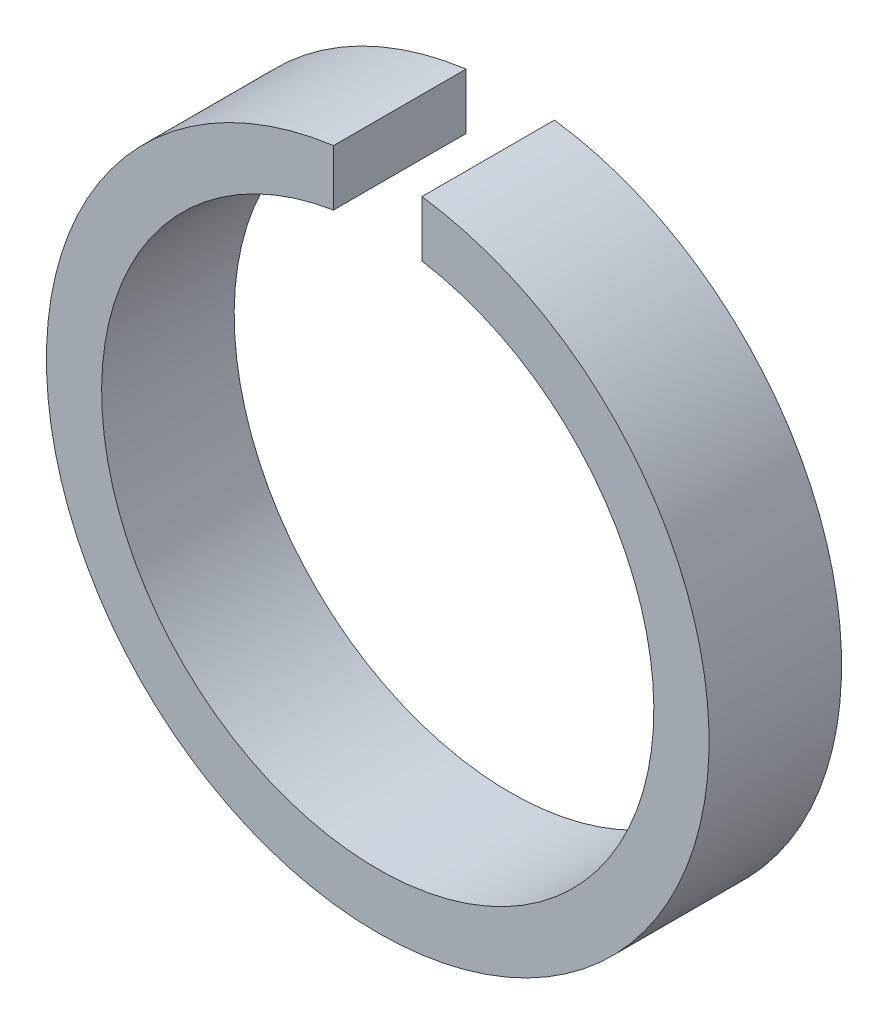
ISO-10303-21;
HEADER;
FILE_DESCRIPTION(('STEP AP214'),'2;1');
FILE_NAME('part.step','',(''),(''),'','','');
FILE_SCHEMA(('AUTOMOTIVE_DESIGN { 1 0 10303 214 1 1 1 1 }'));
ENDSEC;
DATA;
#1=APPLICATION_CONTEXT('core data for automotive mechanical design processes');
#2=APPLICATION_PROTOCOL_DEFINITION('international standard','automotive_design',2000,#1);
#3=PRODUCT_CONTEXT('',#1,'mechanical');
#4=PRODUCT('Part','Part','',(#3));
#5=PRODUCT_RELATED_PRODUCT_CATEGORY('part','',(#4));
#6=PRODUCT_DEFINITION_FORMATION('','',#4);
#7=PRODUCT_DEFINITION_CONTEXT('part definition',#1,'design');
#8=PRODUCT_DEFINITION('design','',#6,#7);
#9=PRODUCT_DEFINITION_SHAPE('','',#8);
#10=(LENGTH_UNIT() NAMED_UNIT(*) SI_UNIT(.MILLI.,.METRE.));
#11=(NAMED_UNIT(*) PLANE_ANGLE_UNIT() SI_UNIT($,.RADIAN.));
#12=(NAMED_UNIT(*) SI_UNIT($,.STERADIAN.) SOLID_ANGLE_UNIT());
#13=UNCERTAINTY_MEASURE_WITH_UNIT(LENGTH_MEASURE(1.E-05),#10,'distance_accuracy_value','');
#14=(GEOMETRIC_REPRESENTATION_CONTEXT(3) GLOBAL_UNCERTAINTY_ASSIGNED_CONTEXT((#13)) GLOBAL_UNIT_ASSIGNED_CONTEXT((#10,
#11,#12)) REPRESENTATION_CONTEXT('',''));
#15=CARTESIAN_POINT('',(0.,0.,0.));
#16=DIRECTION('',(0.,0.,1.));
#17=DIRECTION('',(1.,0.,0.));
#18=AXIS2_PLACEMENT_3D('',#15,#16,#17);
#19=CARTESIAN_POINT('',(0.,0.,3.));
#20=DIRECTION('',(0.,0.,1.));
#21=DIRECTION('',(1.,0.,0.));
#22=AXIS2_PLACEMENT_3D('',#19,#20,#21);
#23=PLANE('',#22);
#24=DIRECTION('',(0.,-1.,0.));
#25=VECTOR('',#24,1.);
#26=CARTESIAN_POINT('',(-1.,0.,3.));
#27=LINE('',#26,#25);
#28=CARTESIAN_POINT('',(-1.,7.43303437365925,3.));
#29=VERTEX_POINT('',#28);
#30=CARTESIAN_POINT('',(-1.,6.16948133962654,3.));
#31=VERTEX_POINT('',#30);
#32=EDGE_CURVE('E56',#29,#31,#27,.T.);
#33=ORIENTED_EDGE('',*,*,#32,.F.);
#34=CARTESIAN_POINT('',(0.,0.,3.));
#35=DIRECTION('',(0.,0.,1.));
#36=DIRECTION('',(1.,0.,0.));
#37=AXIS2_PLACEMENT_3D('',#34,#35,#36);
#38=CIRCLE('',#37,7.5);
#39=CARTESIAN_POINT('',(1.,7.43303437365925,3.));
#40=VERTEX_POINT('',#39);
#41=EDGE_CURVE('E87',#29,#40,#38,.T.);
#42=ORIENTED_EDGE('',*,*,#41,.T.);
#43=DIRECTION('',(0.,1.,0.));
#44=VECTOR('',#43,1.);
#45=CARTESIAN_POINT('',(1.,0.,3.));
#46=LINE('',#45,#44);
#47=CARTESIAN_POINT('',(1.,6.16948133962654,3.));
#48=VERTEX_POINT('',#47);
#49=EDGE_CURVE('E90',#48,#40,#46,.T.);
#50=ORIENTED_EDGE('',*,*,#49,.F.);
#51=CARTESIAN_POINT('',(0.,0.,3.));
#52=DIRECTION('',(0.,0.,1.));
#53=DIRECTION('',(1.,0.,0.));
#54=AXIS2_PLACEMENT_3D('',#51,#52,#53);
#55=CIRCLE('',#54,6.25);
#56=EDGE_CURVE('E89',#31,#48,#55,.T.);
#57=ORIENTED_EDGE('',*,*,#56,.F.);
#58=EDGE_LOOP('',(#33,#42,#50,#57));
#59=FACE_BOUND('',#58,.T.);
#60=ADVANCED_FACE('F34',(#59),#23,.T.);
#61=CARTESIAN_POINT('',(0.,0.,0.));
#62=DIRECTION('',(0.,0.,1.));
#63=DIRECTION('',(1.,0.,0.));
#64=AXIS2_PLACEMENT_3D('',#61,#62,#63);
#65=PLANE('',#64);
#66=CARTESIAN_POINT('',(0.,0.,0.));
#67=DIRECTION('',(0.,0.,1.));
#68=DIRECTION('',(1.,0.,0.));
#69=AXIS2_PLACEMENT_3D('',#66,#67,#68);
#70=CIRCLE('',#69,7.5);
#71=CARTESIAN_POINT('',(-1.,7.43303437365925,0.));
#72=VERTEX_POINT('',#71);
#73=CARTESIAN_POINT('',(1.,7.43303437365925,0.));
#74=VERTEX_POINT('',#73);
#75=EDGE_CURVE('E93',#72,#74,#70,.T.);
#76=ORIENTED_EDGE('',*,*,#75,.F.);
#77=DIRECTION('',(0.,-1.,0.));
#78=VECTOR('',#77,1.);
#79=CARTESIAN_POINT('',(-1.,0.,0.));
#80=LINE('',#79,#78);
#81=CARTESIAN_POINT('',(-1.,6.16948133962654,0.));
#82=VERTEX_POINT('',#81);
#83=EDGE_CURVE('E75',#72,#82,#80,.T.);
#84=ORIENTED_EDGE('',*,*,#83,.T.);
#85=CARTESIAN_POINT('',(0.,0.,0.));
#86=DIRECTION('',(0.,0.,1.));
#87=DIRECTION('',(1.,0.,0.));
#88=AXIS2_PLACEMENT_3D('',#85,#86,#87);
#89=CIRCLE('',#88,6.25);
#90=CARTESIAN_POINT('',(1.,6.16948133962654,0.));
#91=VERTEX_POINT('',#90);
#92=EDGE_CURVE('E80',#82,#91,#89,.T.);
#93=ORIENTED_EDGE('',*,*,#92,.T.);
#94=DIRECTION('',(0.,1.,0.));
#95=VECTOR('',#94,1.);
#96=CARTESIAN_POINT('',(1.,0.,0.));
#97=LINE('',#96,#95);
#98=EDGE_CURVE('E49',#91,#74,#97,.T.);
#99=ORIENTED_EDGE('',*,*,#98,.T.);
#100=EDGE_LOOP('',(#76,#84,#93,#99));
#101=FACE_BOUND('',#100,.T.);
#102=ADVANCED_FACE('F105',(#101),#65,.F.);
#103=CARTESIAN_POINT('',(0.,0.,3.));
#104=DIRECTION('',(0.,0.,-1.));
#105=DIRECTION('',(-1.,0.,0.));
#106=AXIS2_PLACEMENT_3D('',#103,#104,#105);
#107=CYLINDRICAL_SURFACE('',#106,7.5);
#108=ORIENTED_EDGE('',*,*,#41,.F.);
#109=DIRECTION('',(0.,0.,-1.));
#110=VECTOR('',#109,1.);
#111=CARTESIAN_POINT('',(-1.,7.43303437365925,3.));
#112=LINE('',#111,#110);
#113=EDGE_CURVE('E72',#29,#72,#112,.T.);
#114=ORIENTED_EDGE('',*,*,#113,.T.);
#115=ORIENTED_EDGE('',*,*,#75,.T.);
#116=DIRECTION('',(0.,0.,-1.));
#117=VECTOR('',#116,1.);
#118=CARTESIAN_POINT('',(1.,7.43303437365925,3.));
#119=LINE('',#118,#117);
#120=EDGE_CURVE('E81',#74,#40,#119,.F.);
#121=ORIENTED_EDGE('',*,*,#120,.T.);
#122=EDGE_LOOP('',(#108,#114,#115,#121));
#123=FACE_BOUND('',#122,.T.);
#124=ADVANCED_FACE('F36',(#123),#107,.T.);
#125=CARTESIAN_POINT('',(0.,0.,3.));
#126=DIRECTION('',(0.,0.,-1.));
#127=DIRECTION('',(-1.,0.,0.));
#128=AXIS2_PLACEMENT_3D('',#125,#126,#127);
#129=CYLINDRICAL_SURFACE('',#128,6.25);
#130=DIRECTION('',(0.,0.,-1.));
#131=VECTOR('',#130,1.);
#132=CARTESIAN_POINT('',(-1.,6.16948133962654,3.));
#133=LINE('',#132,#131);
#134=EDGE_CURVE('E11',#31,#82,#133,.T.);
#135=ORIENTED_EDGE('',*,*,#134,.F.);
#136=ORIENTED_EDGE('',*,*,#56,.T.);
#137=DIRECTION('',(0.,0.,-1.));
#138=VECTOR('',#137,1.);
#139=CARTESIAN_POINT('',(1.,6.16948133962654,3.));
#140=LINE('',#139,#138);
#141=EDGE_CURVE('E42',#91,#48,#140,.F.);
#142=ORIENTED_EDGE('',*,*,#141,.F.);
#143=ORIENTED_EDGE('',*,*,#92,.F.);
#144=EDGE_LOOP('',(#135,#136,#142,#143));
#145=FACE_BOUND('',#144,.T.);
#146=ADVANCED_FACE('F107',(#145),#129,.F.);
#147=CARTESIAN_POINT('',(1.,0.,0.));
#148=DIRECTION('',(1.,0.,0.));
#149=DIRECTION('',(0.,0.,-1.));
#150=AXIS2_PLACEMENT_3D('',#147,#148,#149);
#151=PLANE('',#150);
#152=ORIENTED_EDGE('',*,*,#98,.F.);
#153=ORIENTED_EDGE('',*,*,#141,.T.);
#154=ORIENTED_EDGE('',*,*,#49,.T.);
#155=ORIENTED_EDGE('',*,*,#120,.F.);
#156=EDGE_LOOP('',(#152,#153,#154,#155));
#157=FACE_BOUND('',#156,.T.);
#158=ADVANCED_FACE('F108',(#157),#151,.F.);
#159=CARTESIAN_POINT('',(-1.,0.,0.));
#160=DIRECTION('',(-1.,0.,0.));
#161=DIRECTION('',(0.,0.,1.));
#162=AXIS2_PLACEMENT_3D('',#159,#160,#161);
#163=PLANE('',#162);
#164=ORIENTED_EDGE('',*,*,#32,.T.);
#165=ORIENTED_EDGE('',*,*,#134,.T.);
#166=ORIENTED_EDGE('',*,*,#83,.F.);
#167=ORIENTED_EDGE('',*,*,#113,.F.);
#168=EDGE_LOOP('',(#164,#165,#166,#167));
#169=FACE_BOUND('',#168,.T.);
#170=ADVANCED_FACE('F73',(#169),#163,.F.);
#171=CLOSED_SHELL('',(#60,#102,#124,#146,#158,#170));
#172=MANIFOLD_SOLID_BREP('B2',#171);
#173=ADVANCED_BREP_SHAPE_REPRESENTATION('',(#18,#172),#14);
#174=SHAPE_DEFINITION_REPRESENTATION(#9,#173);
ENDSEC;
END-ISO-10303-21;
